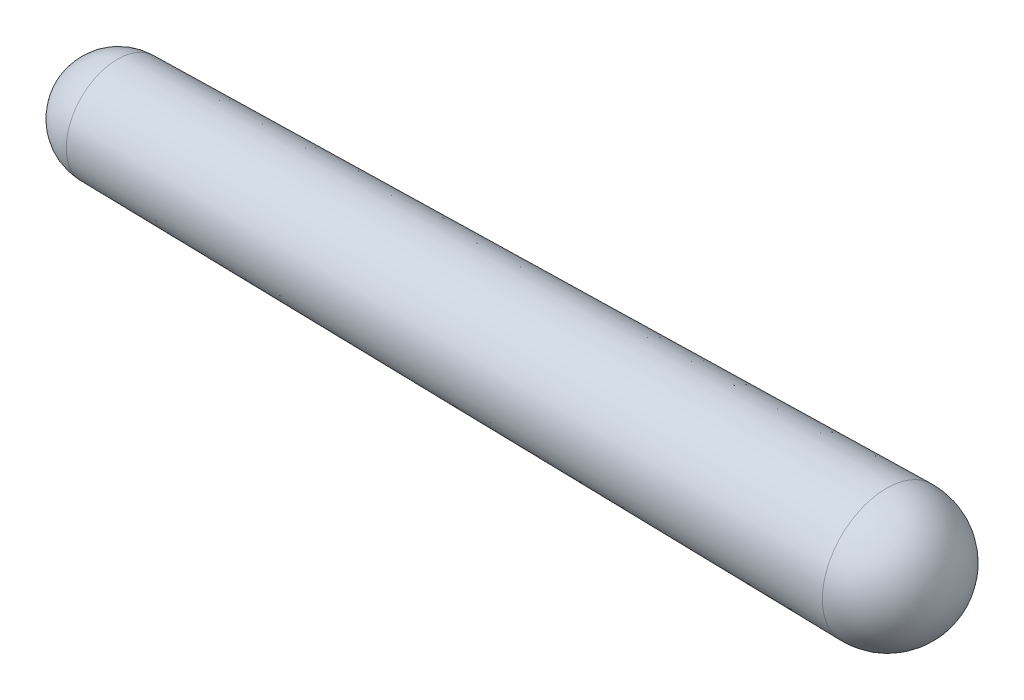
ISO-10303-21;
HEADER;
FILE_DESCRIPTION(('STEP AP214'),'2;1');
FILE_NAME('part.step','',(''),(''),'','','');
FILE_SCHEMA(('AUTOMOTIVE_DESIGN { 1 0 10303 214 1 1 1 1 }'));
ENDSEC;
DATA;
#1=APPLICATION_CONTEXT('core data for automotive mechanical design processes');
#2=APPLICATION_PROTOCOL_DEFINITION('international standard','automotive_design',2000,#1);
#3=PRODUCT_CONTEXT('',#1,'mechanical');
#4=PRODUCT('Part','Part','',(#3));
#5=PRODUCT_RELATED_PRODUCT_CATEGORY('part','',(#4));
#6=PRODUCT_DEFINITION_FORMATION('','',#4);
#7=PRODUCT_DEFINITION_CONTEXT('part definition',#1,'design');
#8=PRODUCT_DEFINITION('design','',#6,#7);
#9=PRODUCT_DEFINITION_SHAPE('','',#8);
#10=(LENGTH_UNIT() NAMED_UNIT(*) SI_UNIT(.MILLI.,.METRE.));
#11=(NAMED_UNIT(*) PLANE_ANGLE_UNIT() SI_UNIT($,.RADIAN.));
#12=(NAMED_UNIT(*) SI_UNIT($,.STERADIAN.) SOLID_ANGLE_UNIT());
#13=UNCERTAINTY_MEASURE_WITH_UNIT(LENGTH_MEASURE(1.E-05),#10,'distance_accuracy_value','');
#14=(GEOMETRIC_REPRESENTATION_CONTEXT(3) GLOBAL_UNCERTAINTY_ASSIGNED_CONTEXT((#13)) GLOBAL_UNIT_ASSIGNED_CONTEXT((#10,
#11,#12)) REPRESENTATION_CONTEXT('',''));
#15=CARTESIAN_POINT('',(0.,0.,0.));
#16=DIRECTION('',(0.,0.,1.));
#17=DIRECTION('',(1.,0.,0.));
#18=AXIS2_PLACEMENT_3D('',#15,#16,#17);
#19=CARTESIAN_POINT('',(-30.,0.,0.));
#20=DIRECTION('',(-1.,0.,0.));
#21=DIRECTION('',(0.,0.,-1.));
#22=AXIS2_PLACEMENT_3D('',#19,#20,#21);
#23=SPHERICAL_SURFACE('',#22,1.99999999999999);
#24=CARTESIAN_POINT('',(-30.0333333333333,0.,0.));
#25=DIRECTION('',(-1.,0.,0.));
#26=DIRECTION('',(0.,0.,1.));
#27=AXIS2_PLACEMENT_3D('',#24,#25,#26);
#28=CIRCLE('',#27,1.99972220292941);
#29=CARTESIAN_POINT('',(-30.0333333333333,0.,1.99972220292941));
#30=VERTEX_POINT('',#29);
#31=EDGE_CURVE('E41',#30,#30,#28,.T.);
#32=ORIENTED_EDGE('',*,*,#31,.T.);
#33=EDGE_LOOP('',(#32));
#34=FACE_BOUND('',#33,.T.);
#35=ADVANCED_FACE('F35',(#34),#23,.T.);
#36=CARTESIAN_POINT('',(0.,0.,0.));
#37=DIRECTION('',(-1.,0.,0.));
#38=DIRECTION('',(0.,0.,-1.));
#39=AXIS2_PLACEMENT_3D('',#36,#37,#38);
#40=SPHERICAL_SURFACE('',#39,2.5);
#41=CARTESIAN_POINT('',(-0.041666666666669,0.,0.));
#42=DIRECTION('',(-1.,0.,0.));
#43=DIRECTION('',(0.,0.,1.));
#44=AXIS2_PLACEMENT_3D('',#41,#42,#43);
#45=CIRCLE('',#44,2.49965275366177);
#46=CARTESIAN_POINT('',(-0.041666666666669,0.,2.49965275366177));
#47=VERTEX_POINT('',#46);
#48=EDGE_CURVE('E10',#47,#47,#45,.T.);
#49=ORIENTED_EDGE('',*,*,#48,.F.);
#50=EDGE_LOOP('',(#49));
#51=FACE_BOUND('',#50,.T.);
#52=ADVANCED_FACE('F50',(#51),#40,.T.);
#53=CARTESIAN_POINT('',(-0.041666666666669,0.,0.));
#54=DIRECTION('',(1.,0.,0.));
#55=DIRECTION('',(0.,0.,-1.));
#56=AXIS2_PLACEMENT_3D('',#53,#54,#55);
#57=CONICAL_SURFACE('',#56,2.49965275366177,0.0166674383680717);
#58=ORIENTED_EDGE('',*,*,#31,.F.);
#59=EDGE_LOOP('',(#58));
#60=FACE_BOUND('',#59,.T.);
#61=ORIENTED_EDGE('',*,*,#48,.T.);
#62=EDGE_LOOP('',(#61));
#63=FACE_BOUND('',#62,.T.);
#64=ADVANCED_FACE('F48',(#60,#63),#57,.T.);
#65=CLOSED_SHELL('',(#35,#52,#64));
#66=MANIFOLD_SOLID_BREP('B2',#65);
#67=ADVANCED_BREP_SHAPE_REPRESENTATION('',(#18,#66),#14);
#68=SHAPE_DEFINITION_REPRESENTATION(#9,#67);
ENDSEC;
END-ISO-10303-21;
